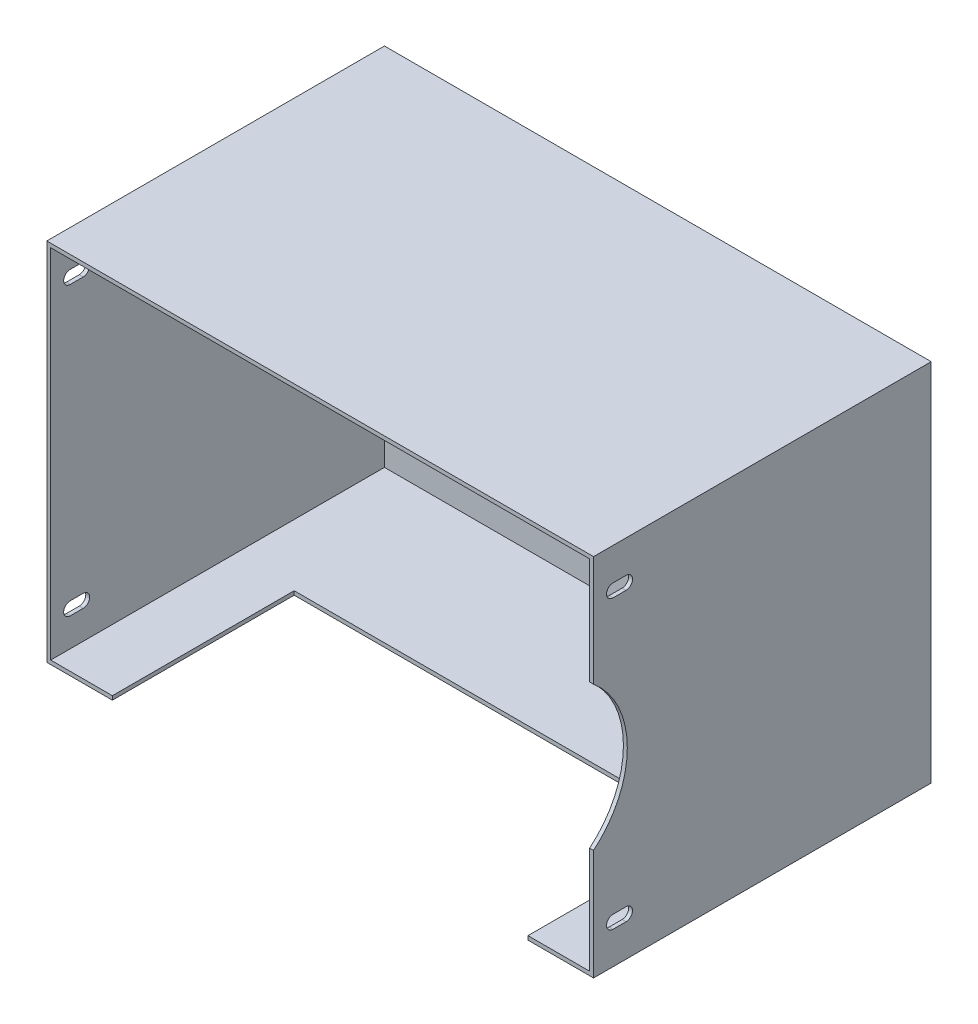
ISO-10303-21;
HEADER;
FILE_DESCRIPTION(('STEP AP214'),'2;1');
FILE_NAME('part.step','',(''),(''),'','','');
FILE_SCHEMA(('AUTOMOTIVE_DESIGN { 1 0 10303 214 1 1 1 1 }'));
ENDSEC;
DATA;
#1=APPLICATION_CONTEXT('core data for automotive mechanical design processes');
#2=APPLICATION_PROTOCOL_DEFINITION('international standard','automotive_design',2000,#1);
#3=PRODUCT_CONTEXT('',#1,'mechanical');
#4=PRODUCT('Part','Part','',(#3));
#5=PRODUCT_RELATED_PRODUCT_CATEGORY('part','',(#4));
#6=PRODUCT_DEFINITION_FORMATION('','',#4);
#7=PRODUCT_DEFINITION_CONTEXT('part definition',#1,'design');
#8=PRODUCT_DEFINITION('design','',#6,#7);
#9=PRODUCT_DEFINITION_SHAPE('','',#8);
#10=(LENGTH_UNIT() NAMED_UNIT(*) SI_UNIT(.MILLI.,.METRE.));
#11=(NAMED_UNIT(*) PLANE_ANGLE_UNIT() SI_UNIT($,.RADIAN.));
#12=(NAMED_UNIT(*) SI_UNIT($,.STERADIAN.) SOLID_ANGLE_UNIT());
#13=UNCERTAINTY_MEASURE_WITH_UNIT(LENGTH_MEASURE(1.E-05),#10,'distance_accuracy_value','');
#14=(GEOMETRIC_REPRESENTATION_CONTEXT(3) GLOBAL_UNCERTAINTY_ASSIGNED_CONTEXT((#13)) GLOBAL_UNIT_ASSIGNED_CONTEXT((#10,
#11,#12)) REPRESENTATION_CONTEXT('',''));
#15=CARTESIAN_POINT('',(0.,0.,0.));
#16=DIRECTION('',(0.,0.,1.));
#17=DIRECTION('',(1.,0.,0.));
#18=AXIS2_PLACEMENT_3D('',#15,#16,#17);
#19=CARTESIAN_POINT('',(0.,0.,130.));
#20=DIRECTION('',(0.,0.,1.));
#21=DIRECTION('',(1.,0.,0.));
#22=AXIS2_PLACEMENT_3D('',#19,#20,#21);
#23=PLANE('',#22);
#24=DIRECTION('',(0.,-1.,0.));
#25=VECTOR('',#24,1.);
#26=CARTESIAN_POINT('',(-80.,70.251,130.));
#27=LINE('',#26,#25);
#28=CARTESIAN_POINT('',(-80.,-68.75,130.));
#29=VERTEX_POINT('',#28);
#30=CARTESIAN_POINT('',(-80.,-70.25,130.));
#31=VERTEX_POINT('',#30);
#32=EDGE_CURVE('E281',#29,#31,#27,.T.);
#33=ORIENTED_EDGE('',*,*,#32,.F.);
#34=DIRECTION('',(1.,0.,0.));
#35=VECTOR('',#34,1.);
#36=CARTESIAN_POINT('',(-105.25,-68.75,130.));
#37=LINE('',#36,#35);
#38=CARTESIAN_POINT('',(-103.75,-68.75,130.));
#39=VERTEX_POINT('',#38);
#40=EDGE_CURVE('E307',#39,#29,#37,.T.);
#41=ORIENTED_EDGE('',*,*,#40,.F.);
#42=DIRECTION('',(0.,-1.,0.));
#43=VECTOR('',#42,1.);
#44=CARTESIAN_POINT('',(-103.75,70.25,130.));
#45=LINE('',#44,#43);
#46=CARTESIAN_POINT('',(-103.75,68.75,130.));
#47=VERTEX_POINT('',#46);
#48=EDGE_CURVE('E323',#47,#39,#45,.T.);
#49=ORIENTED_EDGE('',*,*,#48,.F.);
#50=DIRECTION('',(-1.,0.,0.));
#51=VECTOR('',#50,1.);
#52=CARTESIAN_POINT('',(-105.25,68.75,130.));
#53=LINE('',#52,#51);
#54=CARTESIAN_POINT('',(103.75,68.75,130.));
#55=VERTEX_POINT('',#54);
#56=EDGE_CURVE('E321',#55,#47,#53,.T.);
#57=ORIENTED_EDGE('',*,*,#56,.F.);
#58=DIRECTION('',(0.,1.,0.));
#59=VECTOR('',#58,1.);
#60=CARTESIAN_POINT('',(103.75,70.25,130.));
#61=LINE('',#60,#59);
#62=CARTESIAN_POINT('',(103.75,27.6947648482527,130.));
#63=VERTEX_POINT('',#62);
#64=EDGE_CURVE('E317',#63,#55,#61,.T.);
#65=ORIENTED_EDGE('',*,*,#64,.F.);
#66=DIRECTION('',(1.,0.,0.));
#67=VECTOR('',#66,1.);
#68=CARTESIAN_POINT('',(-105.251,27.6947648482527,130.));
#69=LINE('',#68,#67);
#70=CARTESIAN_POINT('',(105.25,27.6947648482527,130.));
#71=VERTEX_POINT('',#70);
#72=EDGE_CURVE('E291',#63,#71,#69,.T.);
#73=ORIENTED_EDGE('',*,*,#72,.T.);
#74=DIRECTION('',(0.,1.,0.));
#75=VECTOR('',#74,1.);
#76=CARTESIAN_POINT('',(105.25,70.25,130.));
#77=LINE('',#76,#75);
#78=CARTESIAN_POINT('',(105.25,70.25,130.));
#79=VERTEX_POINT('',#78);
#80=EDGE_CURVE('E333',#71,#79,#77,.T.);
#81=ORIENTED_EDGE('',*,*,#80,.T.);
#82=DIRECTION('',(-1.,0.,0.));
#83=VECTOR('',#82,1.);
#84=CARTESIAN_POINT('',(-105.25,70.25,130.));
#85=LINE('',#84,#83);
#86=CARTESIAN_POINT('',(-105.25,70.25,130.));
#87=VERTEX_POINT('',#86);
#88=EDGE_CURVE('E332',#79,#87,#85,.T.);
#89=ORIENTED_EDGE('',*,*,#88,.T.);
#90=DIRECTION('',(0.,-1.,0.));
#91=VECTOR('',#90,1.);
#92=CARTESIAN_POINT('',(-105.25,70.25,130.));
#93=LINE('',#92,#91);
#94=CARTESIAN_POINT('',(-105.25,-70.25,130.));
#95=VERTEX_POINT('',#94);
#96=EDGE_CURVE('E335',#87,#95,#93,.T.);
#97=ORIENTED_EDGE('',*,*,#96,.T.);
#98=DIRECTION('',(1.,0.,0.));
#99=VECTOR('',#98,1.);
#100=CARTESIAN_POINT('',(-105.25,-70.25,130.));
#101=LINE('',#100,#99);
#102=EDGE_CURVE('E338',#95,#31,#101,.T.);
#103=ORIENTED_EDGE('',*,*,#102,.T.);
#104=EDGE_LOOP('',(#33,#41,#49,#57,#65,#73,#81,#89,#97,#103));
#105=FACE_BOUND('',#104,.T.);
#106=ADVANCED_FACE('F34',(#105),#23,.T.);
#107=CARTESIAN_POINT('',(105.25,70.25,130.));
#108=DIRECTION('',(-1.,0.,0.));
#109=DIRECTION('',(0.,-1.,0.));
#110=AXIS2_PLACEMENT_3D('',#107,#108,#109);
#111=PLANE('',#110);
#112=DIRECTION('',(0.,0.,1.));
#113=VECTOR('',#112,1.);
#114=CARTESIAN_POINT('',(105.25,52.75,122.5));
#115=LINE('',#114,#113);
#116=CARTESIAN_POINT('',(105.25,52.75,122.5));
#117=VERTEX_POINT('',#116);
#118=CARTESIAN_POINT('',(105.25,52.75,117.5));
#119=VERTEX_POINT('',#118);
#120=EDGE_CURVE('E250',#117,#119,#115,.F.);
#121=ORIENTED_EDGE('',*,*,#120,.F.);
#122=CARTESIAN_POINT('',(105.25,55.25,122.5));
#123=DIRECTION('',(1.,0.,0.));
#124=DIRECTION('',(0.,1.,0.));
#125=AXIS2_PLACEMENT_3D('',#122,#123,#124);
#126=CIRCLE('',#125,2.5);
#127=CARTESIAN_POINT('',(105.25,57.75,122.5));
#128=VERTEX_POINT('',#127);
#129=EDGE_CURVE('E38',#128,#117,#126,.T.);
#130=ORIENTED_EDGE('',*,*,#129,.F.);
#131=DIRECTION('',(0.,0.,1.));
#132=VECTOR('',#131,1.);
#133=CARTESIAN_POINT('',(105.25,57.75,122.5));
#134=LINE('',#133,#132);
#135=CARTESIAN_POINT('',(105.25,57.75,117.5));
#136=VERTEX_POINT('',#135);
#137=EDGE_CURVE('E85',#136,#128,#134,.T.);
#138=ORIENTED_EDGE('',*,*,#137,.F.);
#139=CARTESIAN_POINT('',(105.25,55.25,117.5));
#140=DIRECTION('',(1.,0.,0.));
#141=DIRECTION('',(0.,1.,0.));
#142=AXIS2_PLACEMENT_3D('',#139,#140,#141);
#143=CIRCLE('',#142,2.5);
#144=EDGE_CURVE('E235',#119,#136,#143,.T.);
#145=ORIENTED_EDGE('',*,*,#144,.F.);
#146=EDGE_LOOP('',(#121,#130,#138,#145));
#147=FACE_BOUND('',#146,.T.);
#148=DIRECTION('',(0.,0.,1.));
#149=VECTOR('',#148,1.);
#150=CARTESIAN_POINT('',(105.25,-57.75,122.5));
#151=LINE('',#150,#149);
#152=CARTESIAN_POINT('',(105.25,-57.75,122.5));
#153=VERTEX_POINT('',#152);
#154=CARTESIAN_POINT('',(105.25,-57.75,117.5));
#155=VERTEX_POINT('',#154);
#156=EDGE_CURVE('E376',#153,#155,#151,.F.);
#157=ORIENTED_EDGE('',*,*,#156,.F.);
#158=CARTESIAN_POINT('',(105.25,-55.25,122.5));
#159=DIRECTION('',(1.,0.,0.));
#160=DIRECTION('',(0.,1.,0.));
#161=AXIS2_PLACEMENT_3D('',#158,#159,#160);
#162=CIRCLE('',#161,2.5);
#163=CARTESIAN_POINT('',(105.25,-52.75,122.5));
#164=VERTEX_POINT('',#163);
#165=EDGE_CURVE('E385',#164,#153,#162,.T.);
#166=ORIENTED_EDGE('',*,*,#165,.F.);
#167=DIRECTION('',(0.,0.,1.));
#168=VECTOR('',#167,1.);
#169=CARTESIAN_POINT('',(105.25,-52.75,122.5));
#170=LINE('',#169,#168);
#171=CARTESIAN_POINT('',(105.25,-52.75,117.5));
#172=VERTEX_POINT('',#171);
#173=EDGE_CURVE('E381',#172,#164,#170,.T.);
#174=ORIENTED_EDGE('',*,*,#173,.F.);
#175=CARTESIAN_POINT('',(105.25,-55.25,117.5));
#176=DIRECTION('',(1.,0.,0.));
#177=DIRECTION('',(0.,1.,0.));
#178=AXIS2_PLACEMENT_3D('',#175,#176,#177);
#179=CIRCLE('',#178,2.5);
#180=EDGE_CURVE('E204',#155,#172,#179,.T.);
#181=ORIENTED_EDGE('',*,*,#180,.F.);
#182=EDGE_LOOP('',(#157,#166,#174,#181));
#183=FACE_BOUND('',#182,.T.);
#184=ORIENTED_EDGE('',*,*,#80,.F.);
#185=CARTESIAN_POINT('',(105.25,0.,153.));
#186=DIRECTION('',(1.,0.,0.));
#187=DIRECTION('',(0.,-1.,0.));
#188=AXIS2_PLACEMENT_3D('',#185,#186,#187);
#189=CIRCLE('',#188,36.0000000000002);
#190=CARTESIAN_POINT('',(105.25,-27.6947648482527,130.));
#191=VERTEX_POINT('',#190);
#192=EDGE_CURVE('E285',#191,#71,#189,.T.);
#193=ORIENTED_EDGE('',*,*,#192,.F.);
#194=CARTESIAN_POINT('',(105.25,-70.25,130.));
#195=VERTEX_POINT('',#194);
#196=EDGE_CURVE('E329',#195,#191,#77,.T.);
#197=ORIENTED_EDGE('',*,*,#196,.F.);
#198=DIRECTION('',(0.,0.,-1.));
#199=VECTOR('',#198,1.);
#200=CARTESIAN_POINT('',(105.25,-70.25,130.));
#201=LINE('',#200,#199);
#202=CARTESIAN_POINT('',(105.25,-70.25,0.));
#203=VERTEX_POINT('',#202);
#204=EDGE_CURVE('E341',#195,#203,#201,.T.);
#205=ORIENTED_EDGE('',*,*,#204,.T.);
#206=DIRECTION('',(0.,1.,0.));
#207=VECTOR('',#206,1.);
#208=CARTESIAN_POINT('',(105.25,70.25,0.));
#209=LINE('',#208,#207);
#210=CARTESIAN_POINT('',(105.25,70.25,0.));
#211=VERTEX_POINT('',#210);
#212=EDGE_CURVE('E301',#203,#211,#209,.T.);
#213=ORIENTED_EDGE('',*,*,#212,.T.);
#214=DIRECTION('',(0.,0.,-1.));
#215=VECTOR('',#214,1.);
#216=CARTESIAN_POINT('',(105.25,70.25,130.));
#217=LINE('',#216,#215);
#218=EDGE_CURVE('E358',#79,#211,#217,.T.);
#219=ORIENTED_EDGE('',*,*,#218,.F.);
#220=EDGE_LOOP('',(#184,#193,#197,#205,#213,#219));
#221=FACE_BOUND('',#220,.T.);
#222=ADVANCED_FACE('F36',(#147,#183,#221),#111,.F.);
#223=CARTESIAN_POINT('',(-105.25,70.25,130.));
#224=DIRECTION('',(0.,-1.,0.));
#225=DIRECTION('',(0.,0.,-1.));
#226=AXIS2_PLACEMENT_3D('',#223,#224,#225);
#227=PLANE('',#226);
#228=DIRECTION('',(-1.,0.,0.));
#229=VECTOR('',#228,1.);
#230=CARTESIAN_POINT('',(-105.25,70.25,0.));
#231=LINE('',#230,#229);
#232=CARTESIAN_POINT('',(-105.25,70.25,0.));
#233=VERTEX_POINT('',#232);
#234=EDGE_CURVE('E344',#211,#233,#231,.T.);
#235=ORIENTED_EDGE('',*,*,#234,.T.);
#236=DIRECTION('',(0.,0.,-1.));
#237=VECTOR('',#236,1.);
#238=CARTESIAN_POINT('',(-105.25,70.25,130.));
#239=LINE('',#238,#237);
#240=EDGE_CURVE('E355',#87,#233,#239,.T.);
#241=ORIENTED_EDGE('',*,*,#240,.F.);
#242=ORIENTED_EDGE('',*,*,#88,.F.);
#243=ORIENTED_EDGE('',*,*,#218,.T.);
#244=EDGE_LOOP('',(#235,#241,#242,#243));
#245=FACE_BOUND('',#244,.T.);
#246=ADVANCED_FACE('F494',(#245),#227,.F.);
#247=CARTESIAN_POINT('',(-105.25,70.25,130.));
#248=DIRECTION('',(1.,0.,0.));
#249=DIRECTION('',(0.,0.,-1.));
#250=AXIS2_PLACEMENT_3D('',#247,#248,#249);
#251=PLANE('',#250);
#252=DIRECTION('',(0.,0.,1.));
#253=VECTOR('',#252,1.);
#254=CARTESIAN_POINT('',(-105.25,57.75,122.5));
#255=LINE('',#254,#253);
#256=CARTESIAN_POINT('',(-105.25,57.75,117.5));
#257=VERTEX_POINT('',#256);
#258=CARTESIAN_POINT('',(-105.25,57.75,122.5));
#259=VERTEX_POINT('',#258);
#260=EDGE_CURVE('E432',#257,#259,#255,.T.);
#261=ORIENTED_EDGE('',*,*,#260,.T.);
#262=CARTESIAN_POINT('',(-105.25,55.25,122.5));
#263=DIRECTION('',(1.,0.,0.));
#264=DIRECTION('',(0.,1.,0.));
#265=AXIS2_PLACEMENT_3D('',#262,#263,#264);
#266=CIRCLE('',#265,2.5);
#267=CARTESIAN_POINT('',(-105.25,52.75,122.5));
#268=VERTEX_POINT('',#267);
#269=EDGE_CURVE('E407',#259,#268,#266,.T.);
#270=ORIENTED_EDGE('',*,*,#269,.T.);
#271=DIRECTION('',(0.,0.,-1.));
#272=VECTOR('',#271,1.);
#273=CARTESIAN_POINT('',(-105.25,52.75,122.5));
#274=LINE('',#273,#272);
#275=CARTESIAN_POINT('',(-105.25,52.75,117.5));
#276=VERTEX_POINT('',#275);
#277=EDGE_CURVE('E438',#268,#276,#274,.T.);
#278=ORIENTED_EDGE('',*,*,#277,.T.);
#279=CARTESIAN_POINT('',(-105.25,55.25,117.5));
#280=DIRECTION('',(1.,0.,0.));
#281=DIRECTION('',(0.,1.,0.));
#282=AXIS2_PLACEMENT_3D('',#279,#280,#281);
#283=CIRCLE('',#282,2.5);
#284=EDGE_CURVE('E435',#276,#257,#283,.T.);
#285=ORIENTED_EDGE('',*,*,#284,.T.);
#286=EDGE_LOOP('',(#261,#270,#278,#285));
#287=FACE_BOUND('',#286,.T.);
#288=DIRECTION('',(0.,0.,1.));
#289=VECTOR('',#288,1.);
#290=CARTESIAN_POINT('',(-105.25,-52.75,122.5));
#291=LINE('',#290,#289);
#292=CARTESIAN_POINT('',(-105.25,-52.75,117.5));
#293=VERTEX_POINT('',#292);
#294=CARTESIAN_POINT('',(-105.25,-52.75,122.5));
#295=VERTEX_POINT('',#294);
#296=EDGE_CURVE('E412',#293,#295,#291,.T.);
#297=ORIENTED_EDGE('',*,*,#296,.T.);
#298=CARTESIAN_POINT('',(-105.25,-55.25,122.5));
#299=DIRECTION('',(1.,0.,0.));
#300=DIRECTION('',(0.,-1.,0.));
#301=AXIS2_PLACEMENT_3D('',#298,#299,#300);
#302=CIRCLE('',#301,2.5);
#303=CARTESIAN_POINT('',(-105.25,-57.75,122.5));
#304=VERTEX_POINT('',#303);
#305=EDGE_CURVE('E421',#295,#304,#302,.T.);
#306=ORIENTED_EDGE('',*,*,#305,.T.);
#307=DIRECTION('',(0.,0.,-1.));
#308=VECTOR('',#307,1.);
#309=CARTESIAN_POINT('',(-105.25,-57.75,122.5));
#310=LINE('',#309,#308);
#311=CARTESIAN_POINT('',(-105.25,-57.75,117.5));
#312=VERTEX_POINT('',#311);
#313=EDGE_CURVE('E418',#304,#312,#310,.T.);
#314=ORIENTED_EDGE('',*,*,#313,.T.);
#315=CARTESIAN_POINT('',(-105.25,-55.25,117.5));
#316=DIRECTION('',(1.,0.,0.));
#317=DIRECTION('',(0.,-1.,0.));
#318=AXIS2_PLACEMENT_3D('',#315,#316,#317);
#319=CIRCLE('',#318,2.5);
#320=EDGE_CURVE('E415',#312,#293,#319,.T.);
#321=ORIENTED_EDGE('',*,*,#320,.T.);
#322=EDGE_LOOP('',(#297,#306,#314,#321));
#323=FACE_BOUND('',#322,.T.);
#324=DIRECTION('',(0.,-1.,0.));
#325=VECTOR('',#324,1.);
#326=CARTESIAN_POINT('',(-105.25,70.25,0.));
#327=LINE('',#326,#325);
#328=CARTESIAN_POINT('',(-105.25,-70.25,0.));
#329=VERTEX_POINT('',#328);
#330=EDGE_CURVE('E346',#233,#329,#327,.T.);
#331=ORIENTED_EDGE('',*,*,#330,.T.);
#332=DIRECTION('',(0.,0.,-1.));
#333=VECTOR('',#332,1.);
#334=CARTESIAN_POINT('',(-105.25,-70.25,130.));
#335=LINE('',#334,#333);
#336=EDGE_CURVE('E352',#95,#329,#335,.T.);
#337=ORIENTED_EDGE('',*,*,#336,.F.);
#338=ORIENTED_EDGE('',*,*,#96,.F.);
#339=ORIENTED_EDGE('',*,*,#240,.T.);
#340=EDGE_LOOP('',(#331,#337,#338,#339));
#341=FACE_BOUND('',#340,.T.);
#342=ADVANCED_FACE('F445',(#287,#323,#341),#251,.F.);
#343=CARTESIAN_POINT('',(-105.25,-70.25,130.));
#344=DIRECTION('',(0.,1.,0.));
#345=DIRECTION('',(0.,0.,1.));
#346=AXIS2_PLACEMENT_3D('',#343,#344,#345);
#347=PLANE('',#346);
#348=DIRECTION('',(1.,0.,0.));
#349=VECTOR('',#348,1.);
#350=CARTESIAN_POINT('',(80.,-70.25,60.));
#351=LINE('',#350,#349);
#352=CARTESIAN_POINT('',(-80.,-70.25,60.));
#353=VERTEX_POINT('',#352);
#354=CARTESIAN_POINT('',(80.,-70.25,60.));
#355=VERTEX_POINT('',#354);
#356=EDGE_CURVE('E272',#353,#355,#351,.T.);
#357=ORIENTED_EDGE('',*,*,#356,.F.);
#358=DIRECTION('',(0.,0.,-1.));
#359=VECTOR('',#358,1.);
#360=CARTESIAN_POINT('',(-80.,-70.25,130.));
#361=LINE('',#360,#359);
#362=EDGE_CURVE('E269',#31,#353,#361,.T.);
#363=ORIENTED_EDGE('',*,*,#362,.F.);
#364=ORIENTED_EDGE('',*,*,#102,.F.);
#365=ORIENTED_EDGE('',*,*,#336,.T.);
#366=DIRECTION('',(1.,0.,0.));
#367=VECTOR('',#366,1.);
#368=CARTESIAN_POINT('',(-105.25,-70.25,0.));
#369=LINE('',#368,#367);
#370=EDGE_CURVE('E348',#329,#203,#369,.T.);
#371=ORIENTED_EDGE('',*,*,#370,.T.);
#372=ORIENTED_EDGE('',*,*,#204,.F.);
#373=CARTESIAN_POINT('',(80.,-70.25,130.));
#374=VERTEX_POINT('',#373);
#375=EDGE_CURVE('E337',#374,#195,#101,.T.);
#376=ORIENTED_EDGE('',*,*,#375,.F.);
#377=DIRECTION('',(0.,0.,1.));
#378=VECTOR('',#377,1.);
#379=CARTESIAN_POINT('',(80.,-70.25,130.));
#380=LINE('',#379,#378);
#381=EDGE_CURVE('E267',#355,#374,#380,.T.);
#382=ORIENTED_EDGE('',*,*,#381,.F.);
#383=EDGE_LOOP('',(#357,#363,#364,#365,#371,#372,#376,#382));
#384=FACE_BOUND('',#383,.T.);
#385=ADVANCED_FACE('F493',(#384),#347,.F.);
#386=DIRECTION('',(0.,-1.,0.));
#387=VECTOR('',#386,1.);
#388=CARTESIAN_POINT('',(80.,70.251,130.));
#389=LINE('',#388,#387);
#390=CARTESIAN_POINT('',(80.,-68.75,130.));
#391=VERTEX_POINT('',#390);
#392=EDGE_CURVE('E275',#391,#374,#389,.T.);
#393=ORIENTED_EDGE('',*,*,#392,.T.);
#394=ORIENTED_EDGE('',*,*,#375,.T.);
#395=ORIENTED_EDGE('',*,*,#196,.T.);
#396=DIRECTION('',(1.,0.,0.));
#397=VECTOR('',#396,1.);
#398=CARTESIAN_POINT('',(-105.251,-27.6947648482527,130.));
#399=LINE('',#398,#397);
#400=CARTESIAN_POINT('',(103.75,-27.6947648482527,130.));
#401=VERTEX_POINT('',#400);
#402=EDGE_CURVE('E288',#401,#191,#399,.T.);
#403=ORIENTED_EDGE('',*,*,#402,.F.);
#404=CARTESIAN_POINT('',(103.75,-68.75,130.));
#405=VERTEX_POINT('',#404);
#406=EDGE_CURVE('E318',#405,#401,#61,.T.);
#407=ORIENTED_EDGE('',*,*,#406,.F.);
#408=EDGE_CURVE('E326',#391,#405,#37,.T.);
#409=ORIENTED_EDGE('',*,*,#408,.F.);
#410=EDGE_LOOP('',(#393,#394,#395,#403,#407,#409));
#411=FACE_BOUND('',#410,.T.);
#412=ADVANCED_FACE('F517',(#411),#23,.T.);
#413=CARTESIAN_POINT('',(0.,0.,0.));
#414=DIRECTION('',(0.,0.,1.));
#415=DIRECTION('',(1.,0.,0.));
#416=AXIS2_PLACEMENT_3D('',#413,#414,#415);
#417=PLANE('',#416);
#418=ORIENTED_EDGE('',*,*,#212,.F.);
#419=ORIENTED_EDGE('',*,*,#370,.F.);
#420=ORIENTED_EDGE('',*,*,#330,.F.);
#421=ORIENTED_EDGE('',*,*,#234,.F.);
#422=EDGE_LOOP('',(#418,#419,#420,#421));
#423=FACE_BOUND('',#422,.T.);
#424=ADVANCED_FACE('F508',(#423),#417,.F.);
#425=CARTESIAN_POINT('',(103.75,70.25,130.));
#426=DIRECTION('',(-1.,0.,0.));
#427=DIRECTION('',(0.,-1.,0.));
#428=AXIS2_PLACEMENT_3D('',#425,#426,#427);
#429=PLANE('',#428);
#430=CARTESIAN_POINT('',(103.75,55.25,122.5));
#431=DIRECTION('',(-1.,0.,0.));
#432=DIRECTION('',(0.,-1.,0.));
#433=AXIS2_PLACEMENT_3D('',#430,#431,#432);
#434=CIRCLE('',#433,2.5);
#435=CARTESIAN_POINT('',(103.75,52.75,122.5));
#436=VERTEX_POINT('',#435);
#437=CARTESIAN_POINT('',(103.75,57.75,122.5));
#438=VERTEX_POINT('',#437);
#439=EDGE_CURVE('E94',#436,#438,#434,.T.);
#440=ORIENTED_EDGE('',*,*,#439,.F.);
#441=DIRECTION('',(0.,0.,1.));
#442=VECTOR('',#441,1.);
#443=CARTESIAN_POINT('',(103.75,52.75,130.));
#444=LINE('',#443,#442);
#445=CARTESIAN_POINT('',(103.75,52.75,117.5));
#446=VERTEX_POINT('',#445);
#447=EDGE_CURVE('E249',#446,#436,#444,.T.);
#448=ORIENTED_EDGE('',*,*,#447,.F.);
#449=CARTESIAN_POINT('',(103.75,55.25,117.5));
#450=DIRECTION('',(-1.,0.,0.));
#451=DIRECTION('',(0.,-1.,0.));
#452=AXIS2_PLACEMENT_3D('',#449,#450,#451);
#453=CIRCLE('',#452,2.5);
#454=CARTESIAN_POINT('',(103.75,57.75,117.5));
#455=VERTEX_POINT('',#454);
#456=EDGE_CURVE('E241',#455,#446,#453,.T.);
#457=ORIENTED_EDGE('',*,*,#456,.F.);
#458=DIRECTION('',(0.,0.,-1.));
#459=VECTOR('',#458,1.);
#460=CARTESIAN_POINT('',(103.75,57.75,130.));
#461=LINE('',#460,#459);
#462=EDGE_CURVE('E228',#438,#455,#461,.T.);
#463=ORIENTED_EDGE('',*,*,#462,.F.);
#464=EDGE_LOOP('',(#440,#448,#457,#463));
#465=FACE_BOUND('',#464,.T.);
#466=CARTESIAN_POINT('',(103.75,-55.25,122.5));
#467=DIRECTION('',(-1.,0.,0.));
#468=DIRECTION('',(0.,-1.,0.));
#469=AXIS2_PLACEMENT_3D('',#466,#467,#468);
#470=CIRCLE('',#469,2.5);
#471=CARTESIAN_POINT('',(103.75,-57.75,122.5));
#472=VERTEX_POINT('',#471);
#473=CARTESIAN_POINT('',(103.75,-52.75,122.5));
#474=VERTEX_POINT('',#473);
#475=EDGE_CURVE('E384',#472,#474,#470,.T.);
#476=ORIENTED_EDGE('',*,*,#475,.F.);
#477=DIRECTION('',(0.,0.,1.));
#478=VECTOR('',#477,1.);
#479=CARTESIAN_POINT('',(103.75,-57.75,130.));
#480=LINE('',#479,#478);
#481=CARTESIAN_POINT('',(103.75,-57.75,117.5));
#482=VERTEX_POINT('',#481);
#483=EDGE_CURVE('E379',#482,#472,#480,.T.);
#484=ORIENTED_EDGE('',*,*,#483,.F.);
#485=CARTESIAN_POINT('',(103.75,-55.25,117.5));
#486=DIRECTION('',(-1.,0.,0.));
#487=DIRECTION('',(0.,-1.,0.));
#488=AXIS2_PLACEMENT_3D('',#485,#486,#487);
#489=CIRCLE('',#488,2.5);
#490=CARTESIAN_POINT('',(103.75,-52.75,117.5));
#491=VERTEX_POINT('',#490);
#492=EDGE_CURVE('E378',#491,#482,#489,.T.);
#493=ORIENTED_EDGE('',*,*,#492,.F.);
#494=DIRECTION('',(0.,0.,-1.));
#495=VECTOR('',#494,1.);
#496=CARTESIAN_POINT('',(103.75,-52.75,130.));
#497=LINE('',#496,#495);
#498=EDGE_CURVE('E214',#474,#491,#497,.T.);
#499=ORIENTED_EDGE('',*,*,#498,.F.);
#500=EDGE_LOOP('',(#476,#484,#493,#499));
#501=FACE_BOUND('',#500,.T.);
#502=CARTESIAN_POINT('',(103.75,0.,153.));
#503=DIRECTION('',(-1.,0.,0.));
#504=DIRECTION('',(0.,-1.,0.));
#505=AXIS2_PLACEMENT_3D('',#502,#503,#504);
#506=CIRCLE('',#505,36.0000000000002);
#507=EDGE_CURVE('E278',#401,#63,#506,.F.);
#508=ORIENTED_EDGE('',*,*,#507,.T.);
#509=ORIENTED_EDGE('',*,*,#64,.T.);
#510=DIRECTION('',(0.,0.,-1.));
#511=VECTOR('',#510,1.);
#512=CARTESIAN_POINT('',(103.75,68.75,130.));
#513=LINE('',#512,#511);
#514=CARTESIAN_POINT('',(103.75,68.75,1.5));
#515=VERTEX_POINT('',#514);
#516=EDGE_CURVE('E298',#55,#515,#513,.T.);
#517=ORIENTED_EDGE('',*,*,#516,.T.);
#518=DIRECTION('',(0.,1.,0.));
#519=VECTOR('',#518,1.);
#520=CARTESIAN_POINT('',(103.75,70.25,1.5));
#521=LINE('',#520,#519);
#522=CARTESIAN_POINT('',(103.75,-68.75,1.5));
#523=VERTEX_POINT('',#522);
#524=EDGE_CURVE('E287',#523,#515,#521,.T.);
#525=ORIENTED_EDGE('',*,*,#524,.F.);
#526=DIRECTION('',(0.,0.,-1.));
#527=VECTOR('',#526,1.);
#528=CARTESIAN_POINT('',(103.75,-68.75,130.));
#529=LINE('',#528,#527);
#530=EDGE_CURVE('E303',#405,#523,#529,.T.);
#531=ORIENTED_EDGE('',*,*,#530,.F.);
#532=ORIENTED_EDGE('',*,*,#406,.T.);
#533=EDGE_LOOP('',(#508,#509,#517,#525,#531,#532));
#534=FACE_BOUND('',#533,.T.);
#535=ADVANCED_FACE('F247',(#465,#501,#534),#429,.T.);
#536=CARTESIAN_POINT('',(-105.25,68.75,130.));
#537=DIRECTION('',(0.,-1.,0.));
#538=DIRECTION('',(0.,0.,-1.));
#539=AXIS2_PLACEMENT_3D('',#536,#537,#538);
#540=PLANE('',#539);
#541=DIRECTION('',(-1.,0.,0.));
#542=VECTOR('',#541,1.);
#543=CARTESIAN_POINT('',(-105.25,68.75,1.5));
#544=LINE('',#543,#542);
#545=CARTESIAN_POINT('',(-103.75,68.75,1.5));
#546=VERTEX_POINT('',#545);
#547=EDGE_CURVE('E297',#515,#546,#544,.T.);
#548=ORIENTED_EDGE('',*,*,#547,.F.);
#549=ORIENTED_EDGE('',*,*,#516,.F.);
#550=ORIENTED_EDGE('',*,*,#56,.T.);
#551=DIRECTION('',(0.,0.,-1.));
#552=VECTOR('',#551,1.);
#553=CARTESIAN_POINT('',(-103.75,68.75,130.));
#554=LINE('',#553,#552);
#555=EDGE_CURVE('E302',#47,#546,#554,.T.);
#556=ORIENTED_EDGE('',*,*,#555,.T.);
#557=EDGE_LOOP('',(#548,#549,#550,#556));
#558=FACE_BOUND('',#557,.T.);
#559=ADVANCED_FACE('F574',(#558),#540,.T.);
#560=CARTESIAN_POINT('',(-103.75,70.25,130.));
#561=DIRECTION('',(1.,0.,0.));
#562=DIRECTION('',(0.,0.,-1.));
#563=AXIS2_PLACEMENT_3D('',#560,#561,#562);
#564=PLANE('',#563);
#565=CARTESIAN_POINT('',(-103.75,55.25,122.5));
#566=DIRECTION('',(1.,0.,0.));
#567=DIRECTION('',(0.,0.,-1.));
#568=AXIS2_PLACEMENT_3D('',#565,#566,#567);
#569=CIRCLE('',#568,2.5);
#570=CARTESIAN_POINT('',(-103.75,57.75,122.5));
#571=VERTEX_POINT('',#570);
#572=CARTESIAN_POINT('',(-103.75,52.75,122.5));
#573=VERTEX_POINT('',#572);
#574=EDGE_CURVE('E11',#571,#573,#569,.T.);
#575=ORIENTED_EDGE('',*,*,#574,.F.);
#576=DIRECTION('',(0.,0.,1.));
#577=VECTOR('',#576,1.);
#578=CARTESIAN_POINT('',(-103.75,57.75,130.));
#579=LINE('',#578,#577);
#580=CARTESIAN_POINT('',(-103.75,57.75,117.5));
#581=VERTEX_POINT('',#580);
#582=EDGE_CURVE('E43',#581,#571,#579,.T.);
#583=ORIENTED_EDGE('',*,*,#582,.F.);
#584=CARTESIAN_POINT('',(-103.75,55.25,117.5));
#585=DIRECTION('',(1.,0.,0.));
#586=DIRECTION('',(0.,0.,-1.));
#587=AXIS2_PLACEMENT_3D('',#584,#585,#586);
#588=CIRCLE('',#587,2.5);
#589=CARTESIAN_POINT('',(-103.75,52.75,117.5));
#590=VERTEX_POINT('',#589);
#591=EDGE_CURVE('E373',#590,#581,#588,.T.);
#592=ORIENTED_EDGE('',*,*,#591,.F.);
#593=DIRECTION('',(0.,0.,-1.));
#594=VECTOR('',#593,1.);
#595=CARTESIAN_POINT('',(-103.75,52.75,130.));
#596=LINE('',#595,#594);
#597=EDGE_CURVE('E371',#573,#590,#596,.T.);
#598=ORIENTED_EDGE('',*,*,#597,.F.);
#599=EDGE_LOOP('',(#575,#583,#592,#598));
#600=FACE_BOUND('',#599,.T.);
#601=CARTESIAN_POINT('',(-103.75,-55.25,122.5));
#602=DIRECTION('',(1.,0.,0.));
#603=DIRECTION('',(0.,0.,-1.));
#604=AXIS2_PLACEMENT_3D('',#601,#602,#603);
#605=CIRCLE('',#604,2.5);
#606=CARTESIAN_POINT('',(-103.75,-52.75,122.5));
#607=VERTEX_POINT('',#606);
#608=CARTESIAN_POINT('',(-103.75,-57.75,122.5));
#609=VERTEX_POINT('',#608);
#610=EDGE_CURVE('E368',#607,#609,#605,.T.);
#611=ORIENTED_EDGE('',*,*,#610,.F.);
#612=DIRECTION('',(0.,0.,1.));
#613=VECTOR('',#612,1.);
#614=CARTESIAN_POINT('',(-103.75,-52.75,130.));
#615=LINE('',#614,#613);
#616=CARTESIAN_POINT('',(-103.75,-52.75,117.5));
#617=VERTEX_POINT('',#616);
#618=EDGE_CURVE('E366',#617,#607,#615,.T.);
#619=ORIENTED_EDGE('',*,*,#618,.F.);
#620=CARTESIAN_POINT('',(-103.75,-55.25,117.5));
#621=DIRECTION('',(1.,0.,0.));
#622=DIRECTION('',(0.,0.,-1.));
#623=AXIS2_PLACEMENT_3D('',#620,#621,#622);
#624=CIRCLE('',#623,2.5);
#625=CARTESIAN_POINT('',(-103.75,-57.75,117.5));
#626=VERTEX_POINT('',#625);
#627=EDGE_CURVE('E364',#626,#617,#624,.T.);
#628=ORIENTED_EDGE('',*,*,#627,.F.);
#629=DIRECTION('',(0.,0.,-1.));
#630=VECTOR('',#629,1.);
#631=CARTESIAN_POINT('',(-103.75,-57.75,130.));
#632=LINE('',#631,#630);
#633=EDGE_CURVE('E361',#609,#626,#632,.T.);
#634=ORIENTED_EDGE('',*,*,#633,.F.);
#635=EDGE_LOOP('',(#611,#619,#628,#634));
#636=FACE_BOUND('',#635,.T.);
#637=DIRECTION('',(0.,-1.,0.));
#638=VECTOR('',#637,1.);
#639=CARTESIAN_POINT('',(-103.75,70.25,1.5));
#640=LINE('',#639,#638);
#641=CARTESIAN_POINT('',(-103.75,-68.75,1.5));
#642=VERTEX_POINT('',#641);
#643=EDGE_CURVE('E309',#546,#642,#640,.T.);
#644=ORIENTED_EDGE('',*,*,#643,.F.);
#645=ORIENTED_EDGE('',*,*,#555,.F.);
#646=ORIENTED_EDGE('',*,*,#48,.T.);
#647=DIRECTION('',(0.,0.,-1.));
#648=VECTOR('',#647,1.);
#649=CARTESIAN_POINT('',(-103.75,-68.75,130.));
#650=LINE('',#649,#648);
#651=EDGE_CURVE('E306',#39,#642,#650,.T.);
#652=ORIENTED_EDGE('',*,*,#651,.T.);
#653=EDGE_LOOP('',(#644,#645,#646,#652));
#654=FACE_BOUND('',#653,.T.);
#655=ADVANCED_FACE('F483',(#600,#636,#654),#564,.T.);
#656=CARTESIAN_POINT('',(-105.25,-68.75,130.));
#657=DIRECTION('',(0.,1.,0.));
#658=DIRECTION('',(0.,0.,1.));
#659=AXIS2_PLACEMENT_3D('',#656,#657,#658);
#660=PLANE('',#659);
#661=DIRECTION('',(0.,0.,-1.));
#662=VECTOR('',#661,1.);
#663=CARTESIAN_POINT('',(-80.,-68.75,130.));
#664=LINE('',#663,#662);
#665=CARTESIAN_POINT('',(-80.,-68.75,60.));
#666=VERTEX_POINT('',#665);
#667=EDGE_CURVE('E258',#29,#666,#664,.T.);
#668=ORIENTED_EDGE('',*,*,#667,.T.);
#669=DIRECTION('',(1.,0.,0.));
#670=VECTOR('',#669,1.);
#671=CARTESIAN_POINT('',(80.,-68.75,60.));
#672=LINE('',#671,#670);
#673=CARTESIAN_POINT('',(80.,-68.75,60.));
#674=VERTEX_POINT('',#673);
#675=EDGE_CURVE('E261',#666,#674,#672,.T.);
#676=ORIENTED_EDGE('',*,*,#675,.T.);
#677=DIRECTION('',(0.,0.,1.));
#678=VECTOR('',#677,1.);
#679=CARTESIAN_POINT('',(80.,-68.75,130.));
#680=LINE('',#679,#678);
#681=EDGE_CURVE('E264',#674,#391,#680,.T.);
#682=ORIENTED_EDGE('',*,*,#681,.T.);
#683=ORIENTED_EDGE('',*,*,#408,.T.);
#684=ORIENTED_EDGE('',*,*,#530,.T.);
#685=DIRECTION('',(1.,0.,0.));
#686=VECTOR('',#685,1.);
#687=CARTESIAN_POINT('',(-105.25,-68.75,1.5));
#688=LINE('',#687,#686);
#689=EDGE_CURVE('E313',#642,#523,#688,.T.);
#690=ORIENTED_EDGE('',*,*,#689,.F.);
#691=ORIENTED_EDGE('',*,*,#651,.F.);
#692=ORIENTED_EDGE('',*,*,#40,.T.);
#693=EDGE_LOOP('',(#668,#676,#682,#683,#684,#690,#691,#692));
#694=FACE_BOUND('',#693,.T.);
#695=ADVANCED_FACE('F525',(#694),#660,.T.);
#696=CARTESIAN_POINT('',(0.,0.,1.5));
#697=DIRECTION('',(0.,0.,1.));
#698=DIRECTION('',(1.,0.,0.));
#699=AXIS2_PLACEMENT_3D('',#696,#697,#698);
#700=PLANE('',#699);
#701=ORIENTED_EDGE('',*,*,#524,.T.);
#702=ORIENTED_EDGE('',*,*,#547,.T.);
#703=ORIENTED_EDGE('',*,*,#643,.T.);
#704=ORIENTED_EDGE('',*,*,#689,.T.);
#705=EDGE_LOOP('',(#701,#702,#703,#704));
#706=FACE_BOUND('',#705,.T.);
#707=ADVANCED_FACE('F733',(#706),#700,.T.);
#708=CARTESIAN_POINT('',(-105.251,0.,153.));
#709=DIRECTION('',(1.,0.,0.));
#710=DIRECTION('',(0.,1.,0.));
#711=AXIS2_PLACEMENT_3D('',#708,#709,#710);
#712=CYLINDRICAL_SURFACE('',#711,36.0000000000002);
#713=ORIENTED_EDGE('',*,*,#402,.T.);
#714=ORIENTED_EDGE('',*,*,#192,.T.);
#715=ORIENTED_EDGE('',*,*,#72,.F.);
#716=ORIENTED_EDGE('',*,*,#507,.F.);
#717=EDGE_LOOP('',(#713,#714,#715,#716));
#718=FACE_BOUND('',#717,.T.);
#719=ADVANCED_FACE('F730',(#718),#712,.F.);
#720=CARTESIAN_POINT('',(-80.,70.251,130.));
#721=DIRECTION('',(-1.,0.,0.));
#722=DIRECTION('',(0.,0.,1.));
#723=AXIS2_PLACEMENT_3D('',#720,#721,#722);
#724=PLANE('',#723);
#725=ORIENTED_EDGE('',*,*,#32,.T.);
#726=ORIENTED_EDGE('',*,*,#362,.T.);
#727=DIRECTION('',(0.,-1.,0.));
#728=VECTOR('',#727,1.);
#729=CARTESIAN_POINT('',(-80.,70.251,60.));
#730=LINE('',#729,#728);
#731=EDGE_CURVE('E279',#666,#353,#730,.T.);
#732=ORIENTED_EDGE('',*,*,#731,.F.);
#733=ORIENTED_EDGE('',*,*,#667,.F.);
#734=EDGE_LOOP('',(#725,#726,#732,#733));
#735=FACE_BOUND('',#734,.T.);
#736=ADVANCED_FACE('F531',(#735),#724,.F.);
#737=CARTESIAN_POINT('',(80.,70.251,60.));
#738=DIRECTION('',(0.,0.,-1.));
#739=DIRECTION('',(-1.,0.,0.));
#740=AXIS2_PLACEMENT_3D('',#737,#738,#739);
#741=PLANE('',#740);
#742=ORIENTED_EDGE('',*,*,#731,.T.);
#743=ORIENTED_EDGE('',*,*,#356,.T.);
#744=DIRECTION('',(0.,-1.,0.));
#745=VECTOR('',#744,1.);
#746=CARTESIAN_POINT('',(80.,70.251,60.));
#747=LINE('',#746,#745);
#748=EDGE_CURVE('E276',#674,#355,#747,.T.);
#749=ORIENTED_EDGE('',*,*,#748,.F.);
#750=ORIENTED_EDGE('',*,*,#675,.F.);
#751=EDGE_LOOP('',(#742,#743,#749,#750));
#752=FACE_BOUND('',#751,.T.);
#753=ADVANCED_FACE('F529',(#752),#741,.F.);
#754=CARTESIAN_POINT('',(80.,70.251,130.));
#755=DIRECTION('',(1.,0.,0.));
#756=DIRECTION('',(0.,0.,-1.));
#757=AXIS2_PLACEMENT_3D('',#754,#755,#756);
#758=PLANE('',#757);
#759=ORIENTED_EDGE('',*,*,#748,.T.);
#760=ORIENTED_EDGE('',*,*,#381,.T.);
#761=ORIENTED_EDGE('',*,*,#392,.F.);
#762=ORIENTED_EDGE('',*,*,#681,.F.);
#763=EDGE_LOOP('',(#759,#760,#761,#762));
#764=FACE_BOUND('',#763,.T.);
#765=ADVANCED_FACE('F522',(#764),#758,.F.);
#766=CARTESIAN_POINT('',(-105.25,-57.75,122.5));
#767=DIRECTION('',(0.,-1.,0.));
#768=DIRECTION('',(1.,0.,0.));
#769=AXIS2_PLACEMENT_3D('',#766,#767,#768);
#770=PLANE('',#769);
#771=ORIENTED_EDGE('',*,*,#633,.T.);
#772=DIRECTION('',(1.,0.,0.));
#773=VECTOR('',#772,1.);
#774=CARTESIAN_POINT('',(-105.25,-57.75,117.5));
#775=LINE('',#774,#773);
#776=EDGE_CURVE('E397',#312,#626,#775,.T.);
#777=ORIENTED_EDGE('',*,*,#776,.F.);
#778=ORIENTED_EDGE('',*,*,#313,.F.);
#779=DIRECTION('',(1.,0.,0.));
#780=VECTOR('',#779,1.);
#781=CARTESIAN_POINT('',(-105.25,-57.75,122.5));
#782=LINE('',#781,#780);
#783=EDGE_CURVE('E402',#304,#609,#782,.T.);
#784=ORIENTED_EDGE('',*,*,#783,.T.);
#785=EDGE_LOOP('',(#771,#777,#778,#784));
#786=FACE_BOUND('',#785,.T.);
#787=ADVANCED_FACE('F475',(#786),#770,.F.);
#788=CARTESIAN_POINT('',(-105.25,-55.25,117.5));
#789=DIRECTION('',(1.,0.,0.));
#790=DIRECTION('',(0.,1.,0.));
#791=AXIS2_PLACEMENT_3D('',#788,#789,#790);
#792=CYLINDRICAL_SURFACE('',#791,2.5);
#793=ORIENTED_EDGE('',*,*,#627,.T.);
#794=DIRECTION('',(1.,0.,0.));
#795=VECTOR('',#794,1.);
#796=CARTESIAN_POINT('',(-105.25,-52.75,117.5));
#797=LINE('',#796,#795);
#798=EDGE_CURVE('E409',#293,#617,#797,.T.);
#799=ORIENTED_EDGE('',*,*,#798,.F.);
#800=ORIENTED_EDGE('',*,*,#320,.F.);
#801=ORIENTED_EDGE('',*,*,#776,.T.);
#802=EDGE_LOOP('',(#793,#799,#800,#801));
#803=FACE_BOUND('',#802,.T.);
#804=ADVANCED_FACE('F481',(#803),#792,.F.);
#805=CARTESIAN_POINT('',(-105.25,-52.75,122.5));
#806=DIRECTION('',(0.,1.,0.));
#807=DIRECTION('',(-1.,0.,0.));
#808=AXIS2_PLACEMENT_3D('',#805,#806,#807);
#809=PLANE('',#808);
#810=ORIENTED_EDGE('',*,*,#618,.T.);
#811=DIRECTION('',(1.,0.,0.));
#812=VECTOR('',#811,1.);
#813=CARTESIAN_POINT('',(-105.25,-52.75,122.5));
#814=LINE('',#813,#812);
#815=EDGE_CURVE('E404',#295,#607,#814,.T.);
#816=ORIENTED_EDGE('',*,*,#815,.F.);
#817=ORIENTED_EDGE('',*,*,#296,.F.);
#818=ORIENTED_EDGE('',*,*,#798,.T.);
#819=EDGE_LOOP('',(#810,#816,#817,#818));
#820=FACE_BOUND('',#819,.T.);
#821=ADVANCED_FACE('F486',(#820),#809,.F.);
#822=CARTESIAN_POINT('',(-105.25,-55.25,122.5));
#823=DIRECTION('',(1.,0.,0.));
#824=DIRECTION('',(0.,1.,0.));
#825=AXIS2_PLACEMENT_3D('',#822,#823,#824);
#826=CYLINDRICAL_SURFACE('',#825,2.5);
#827=ORIENTED_EDGE('',*,*,#610,.T.);
#828=ORIENTED_EDGE('',*,*,#783,.F.);
#829=ORIENTED_EDGE('',*,*,#305,.F.);
#830=ORIENTED_EDGE('',*,*,#815,.T.);
#831=EDGE_LOOP('',(#827,#828,#829,#830));
#832=FACE_BOUND('',#831,.T.);
#833=ADVANCED_FACE('F490',(#832),#826,.F.);
#834=CARTESIAN_POINT('',(-105.25,52.75,122.5));
#835=DIRECTION('',(0.,-1.,0.));
#836=DIRECTION('',(1.,0.,0.));
#837=AXIS2_PLACEMENT_3D('',#834,#835,#836);
#838=PLANE('',#837);
#839=ORIENTED_EDGE('',*,*,#597,.T.);
#840=DIRECTION('',(1.,0.,0.));
#841=VECTOR('',#840,1.);
#842=CARTESIAN_POINT('',(-105.25,52.75,117.5));
#843=LINE('',#842,#841);
#844=EDGE_CURVE('E245',#276,#590,#843,.T.);
#845=ORIENTED_EDGE('',*,*,#844,.F.);
#846=ORIENTED_EDGE('',*,*,#277,.F.);
#847=DIRECTION('',(1.,0.,0.));
#848=VECTOR('',#847,1.);
#849=CARTESIAN_POINT('',(-105.25,52.75,122.5));
#850=LINE('',#849,#848);
#851=EDGE_CURVE('E427',#268,#573,#850,.T.);
#852=ORIENTED_EDGE('',*,*,#851,.T.);
#853=EDGE_LOOP('',(#839,#845,#846,#852));
#854=FACE_BOUND('',#853,.T.);
#855=ADVANCED_FACE('F626',(#854),#838,.F.);
#856=CARTESIAN_POINT('',(-105.25,55.25,117.5));
#857=DIRECTION('',(1.,0.,0.));
#858=DIRECTION('',(0.,1.,0.));
#859=AXIS2_PLACEMENT_3D('',#856,#857,#858);
#860=CYLINDRICAL_SURFACE('',#859,2.5);
#861=ORIENTED_EDGE('',*,*,#591,.T.);
#862=DIRECTION('',(1.,0.,0.));
#863=VECTOR('',#862,1.);
#864=CARTESIAN_POINT('',(-105.25,57.75,117.5));
#865=LINE('',#864,#863);
#866=EDGE_CURVE('E244',#257,#581,#865,.T.);
#867=ORIENTED_EDGE('',*,*,#866,.F.);
#868=ORIENTED_EDGE('',*,*,#284,.F.);
#869=ORIENTED_EDGE('',*,*,#844,.T.);
#870=EDGE_LOOP('',(#861,#867,#868,#869));
#871=FACE_BOUND('',#870,.T.);
#872=ADVANCED_FACE('F636',(#871),#860,.F.);
#873=CARTESIAN_POINT('',(-105.25,57.75,122.5));
#874=DIRECTION('',(0.,1.,0.));
#875=DIRECTION('',(-1.,0.,0.));
#876=AXIS2_PLACEMENT_3D('',#873,#874,#875);
#877=PLANE('',#876);
#878=ORIENTED_EDGE('',*,*,#582,.T.);
#879=DIRECTION('',(1.,0.,0.));
#880=VECTOR('',#879,1.);
#881=CARTESIAN_POINT('',(-105.25,57.75,122.5));
#882=LINE('',#881,#880);
#883=EDGE_CURVE('E396',#259,#571,#882,.T.);
#884=ORIENTED_EDGE('',*,*,#883,.F.);
#885=ORIENTED_EDGE('',*,*,#260,.F.);
#886=ORIENTED_EDGE('',*,*,#866,.T.);
#887=EDGE_LOOP('',(#878,#884,#885,#886));
#888=FACE_BOUND('',#887,.T.);
#889=ADVANCED_FACE('F647',(#888),#877,.F.);
#890=CARTESIAN_POINT('',(-105.25,55.25,122.5));
#891=DIRECTION('',(1.,0.,0.));
#892=DIRECTION('',(0.,1.,0.));
#893=AXIS2_PLACEMENT_3D('',#890,#891,#892);
#894=CYLINDRICAL_SURFACE('',#893,2.5);
#895=ORIENTED_EDGE('',*,*,#574,.T.);
#896=ORIENTED_EDGE('',*,*,#851,.F.);
#897=ORIENTED_EDGE('',*,*,#269,.F.);
#898=ORIENTED_EDGE('',*,*,#883,.T.);
#899=EDGE_LOOP('',(#895,#896,#897,#898));
#900=FACE_BOUND('',#899,.T.);
#901=ADVANCED_FACE('F455',(#900),#894,.F.);
#902=EDGE_CURVE('E60',#472,#153,#782,.T.);
#903=ORIENTED_EDGE('',*,*,#902,.F.);
#904=ORIENTED_EDGE('',*,*,#475,.T.);
#905=EDGE_CURVE('E408',#474,#164,#814,.T.);
#906=ORIENTED_EDGE('',*,*,#905,.T.);
#907=ORIENTED_EDGE('',*,*,#165,.T.);
#908=EDGE_LOOP('',(#903,#904,#906,#907));
#909=FACE_BOUND('',#908,.T.);
#910=ADVANCED_FACE('F628',(#909),#826,.F.);
#911=ORIENTED_EDGE('',*,*,#905,.F.);
#912=ORIENTED_EDGE('',*,*,#498,.T.);
#913=EDGE_CURVE('E400',#491,#172,#797,.T.);
#914=ORIENTED_EDGE('',*,*,#913,.T.);
#915=ORIENTED_EDGE('',*,*,#173,.T.);
#916=EDGE_LOOP('',(#911,#912,#914,#915));
#917=FACE_BOUND('',#916,.T.);
#918=ADVANCED_FACE('F618',(#917),#809,.F.);
#919=ORIENTED_EDGE('',*,*,#913,.F.);
#920=ORIENTED_EDGE('',*,*,#492,.T.);
#921=EDGE_CURVE('E401',#482,#155,#775,.T.);
#922=ORIENTED_EDGE('',*,*,#921,.T.);
#923=ORIENTED_EDGE('',*,*,#180,.T.);
#924=EDGE_LOOP('',(#919,#920,#922,#923));
#925=FACE_BOUND('',#924,.T.);
#926=ADVANCED_FACE('F609',(#925),#792,.F.);
#927=ORIENTED_EDGE('',*,*,#921,.F.);
#928=ORIENTED_EDGE('',*,*,#483,.T.);
#929=ORIENTED_EDGE('',*,*,#902,.T.);
#930=ORIENTED_EDGE('',*,*,#156,.T.);
#931=EDGE_LOOP('',(#927,#928,#929,#930));
#932=FACE_BOUND('',#931,.T.);
#933=ADVANCED_FACE('F598',(#932),#770,.F.);
#934=EDGE_CURVE('E51',#436,#117,#850,.T.);
#935=ORIENTED_EDGE('',*,*,#934,.F.);
#936=ORIENTED_EDGE('',*,*,#439,.T.);
#937=EDGE_CURVE('E232',#438,#128,#882,.T.);
#938=ORIENTED_EDGE('',*,*,#937,.T.);
#939=ORIENTED_EDGE('',*,*,#129,.T.);
#940=EDGE_LOOP('',(#935,#936,#938,#939));
#941=FACE_BOUND('',#940,.T.);
#942=ADVANCED_FACE('F666',(#941),#894,.F.);
#943=ORIENTED_EDGE('',*,*,#937,.F.);
#944=ORIENTED_EDGE('',*,*,#462,.T.);
#945=EDGE_CURVE('E231',#455,#136,#865,.T.);
#946=ORIENTED_EDGE('',*,*,#945,.T.);
#947=ORIENTED_EDGE('',*,*,#137,.T.);
#948=EDGE_LOOP('',(#943,#944,#946,#947));
#949=FACE_BOUND('',#948,.T.);
#950=ADVANCED_FACE('F230',(#949),#877,.F.);
#951=ORIENTED_EDGE('',*,*,#945,.F.);
#952=ORIENTED_EDGE('',*,*,#456,.T.);
#953=EDGE_CURVE('E426',#446,#119,#843,.T.);
#954=ORIENTED_EDGE('',*,*,#953,.T.);
#955=ORIENTED_EDGE('',*,*,#144,.T.);
#956=EDGE_LOOP('',(#951,#952,#954,#955));
#957=FACE_BOUND('',#956,.T.);
#958=ADVANCED_FACE('F239',(#957),#860,.F.);
#959=ORIENTED_EDGE('',*,*,#953,.F.);
#960=ORIENTED_EDGE('',*,*,#447,.T.);
#961=ORIENTED_EDGE('',*,*,#934,.T.);
#962=ORIENTED_EDGE('',*,*,#120,.T.);
#963=EDGE_LOOP('',(#959,#960,#961,#962));
#964=FACE_BOUND('',#963,.T.);
#965=ADVANCED_FACE('F639',(#964),#838,.F.);
#966=CLOSED_SHELL('',(#106,#222,#246,#342,#385,#412,#424,#535,#559,#655,#695,#707,#719,#736,
#753,#765,#787,#804,#821,#833,#855,#872,#889,#901,#910,#918,#926,#933,#942,#950,#958,#965));
#967=MANIFOLD_SOLID_BREP('B2',#966);
#968=ADVANCED_BREP_SHAPE_REPRESENTATION('',(#18,#967),#14);
#969=SHAPE_DEFINITION_REPRESENTATION(#9,#968);
ENDSEC;
END-ISO-10303-21;
